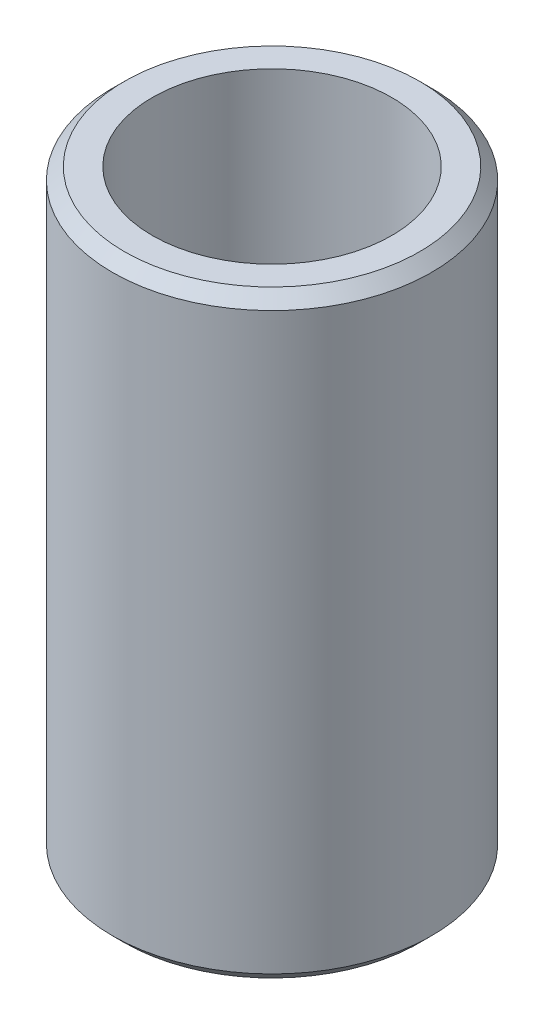
ISO-10303-21;
HEADER;
FILE_DESCRIPTION(('STEP AP214'),'2;1');
FILE_NAME('part.step','',(''),(''),'','','');
FILE_SCHEMA(('AUTOMOTIVE_DESIGN { 1 0 10303 214 1 1 1 1 }'));
ENDSEC;
DATA;
#1=APPLICATION_CONTEXT('core data for automotive mechanical design processes');
#2=APPLICATION_PROTOCOL_DEFINITION('international standard','automotive_design',2000,#1);
#3=PRODUCT_CONTEXT('',#1,'mechanical');
#4=PRODUCT('Part','Part','',(#3));
#5=PRODUCT_RELATED_PRODUCT_CATEGORY('part','',(#4));
#6=PRODUCT_DEFINITION_FORMATION('','',#4);
#7=PRODUCT_DEFINITION_CONTEXT('part definition',#1,'design');
#8=PRODUCT_DEFINITION('design','',#6,#7);
#9=PRODUCT_DEFINITION_SHAPE('','',#8);
#10=(LENGTH_UNIT() NAMED_UNIT(*) SI_UNIT(.MILLI.,.METRE.));
#11=(NAMED_UNIT(*) PLANE_ANGLE_UNIT() SI_UNIT($,.RADIAN.));
#12=(NAMED_UNIT(*) SI_UNIT($,.STERADIAN.) SOLID_ANGLE_UNIT());
#13=UNCERTAINTY_MEASURE_WITH_UNIT(LENGTH_MEASURE(1.E-05),#10,'distance_accuracy_value','');
#14=(GEOMETRIC_REPRESENTATION_CONTEXT(3) GLOBAL_UNCERTAINTY_ASSIGNED_CONTEXT((#13)) GLOBAL_UNIT_ASSIGNED_CONTEXT((#10,
#11,#12)) REPRESENTATION_CONTEXT('',''));
#15=CARTESIAN_POINT('',(0.,0.,0.));
#16=DIRECTION('',(0.,0.,1.));
#17=DIRECTION('',(1.,0.,0.));
#18=AXIS2_PLACEMENT_3D('',#15,#16,#17);
#19=CARTESIAN_POINT('',(0.,15.,0.));
#20=DIRECTION('',(0.,1.,0.));
#21=DIRECTION('',(0.,0.,1.));
#22=AXIS2_PLACEMENT_3D('',#19,#20,#21);
#23=PLANE('',#22);
#24=CARTESIAN_POINT('',(0.,15.,0.));
#25=DIRECTION('',(0.,1.,0.));
#26=DIRECTION('',(0.,0.,1.));
#27=AXIS2_PLACEMENT_3D('',#24,#25,#26);
#28=CIRCLE('',#27,3.70000000000001);
#29=CARTESIAN_POINT('',(0.,15.,3.70000000000001));
#30=VERTEX_POINT('',#29);
#31=EDGE_CURVE('E10',#30,#30,#28,.T.);
#32=ORIENTED_EDGE('',*,*,#31,.T.);
#33=EDGE_LOOP('',(#32));
#34=FACE_BOUND('',#33,.T.);
#35=CARTESIAN_POINT('',(0.,15.,0.));
#36=DIRECTION('',(0.,1.,0.));
#37=DIRECTION('',(0.,0.,1.));
#38=AXIS2_PLACEMENT_3D('',#35,#36,#37);
#39=CIRCLE('',#38,3.);
#40=CARTESIAN_POINT('',(0.,15.,3.));
#41=VERTEX_POINT('',#40);
#42=EDGE_CURVE('E54',#41,#41,#39,.T.);
#43=ORIENTED_EDGE('',*,*,#42,.F.);
#44=EDGE_LOOP('',(#43));
#45=FACE_BOUND('',#44,.T.);
#46=ADVANCED_FACE('F33',(#34,#45),#23,.T.);
#47=CARTESIAN_POINT('',(0.,0.,0.));
#48=DIRECTION('',(0.,1.,0.));
#49=DIRECTION('',(0.,0.,1.));
#50=AXIS2_PLACEMENT_3D('',#47,#48,#49);
#51=PLANE('',#50);
#52=CARTESIAN_POINT('',(0.,0.,0.));
#53=DIRECTION('',(0.,1.,0.));
#54=DIRECTION('',(0.,0.,1.));
#55=AXIS2_PLACEMENT_3D('',#52,#53,#54);
#56=CIRCLE('',#55,3.69999999999999);
#57=CARTESIAN_POINT('',(0.,0.,3.69999999999999));
#58=VERTEX_POINT('',#57);
#59=EDGE_CURVE('E41',#58,#58,#56,.F.);
#60=ORIENTED_EDGE('',*,*,#59,.T.);
#61=EDGE_LOOP('',(#60));
#62=FACE_BOUND('',#61,.T.);
#63=CARTESIAN_POINT('',(0.,0.,0.));
#64=DIRECTION('',(0.,1.,0.));
#65=DIRECTION('',(0.,0.,1.));
#66=AXIS2_PLACEMENT_3D('',#63,#64,#65);
#67=CIRCLE('',#66,3.);
#68=CARTESIAN_POINT('',(0.,0.,3.));
#69=VERTEX_POINT('',#68);
#70=EDGE_CURVE('E55',#69,#69,#67,.T.);
#71=ORIENTED_EDGE('',*,*,#70,.T.);
#72=EDGE_LOOP('',(#71));
#73=FACE_BOUND('',#72,.T.);
#74=ADVANCED_FACE('F65',(#62,#73),#51,.F.);
#75=CARTESIAN_POINT('',(0.,15.,0.));
#76=DIRECTION('',(0.,-1.,0.));
#77=DIRECTION('',(0.,0.,-1.));
#78=AXIS2_PLACEMENT_3D('',#75,#76,#77);
#79=CYLINDRICAL_SURFACE('',#78,4.);
#80=CARTESIAN_POINT('',(0.,0.300000000000005,0.));
#81=DIRECTION('',(0.,1.,0.));
#82=DIRECTION('',(0.,0.,1.));
#83=AXIS2_PLACEMENT_3D('',#80,#81,#82);
#84=CIRCLE('',#83,4.);
#85=CARTESIAN_POINT('',(0.,0.300000000000005,4.));
#86=VERTEX_POINT('',#85);
#87=EDGE_CURVE('E45',#86,#86,#84,.T.);
#88=ORIENTED_EDGE('',*,*,#87,.T.);
#89=EDGE_LOOP('',(#88));
#90=FACE_BOUND('',#89,.T.);
#91=CARTESIAN_POINT('',(0.,14.7,0.));
#92=DIRECTION('',(0.,1.,0.));
#93=DIRECTION('',(0.,0.,1.));
#94=AXIS2_PLACEMENT_3D('',#91,#92,#93);
#95=CIRCLE('',#94,4.);
#96=CARTESIAN_POINT('',(0.,14.7,4.));
#97=VERTEX_POINT('',#96);
#98=EDGE_CURVE('E49',#97,#97,#95,.F.);
#99=ORIENTED_EDGE('',*,*,#98,.T.);
#100=EDGE_LOOP('',(#99));
#101=FACE_BOUND('',#100,.T.);
#102=ADVANCED_FACE('F70',(#90,#101),#79,.T.);
#103=CARTESIAN_POINT('',(0.,15.,0.));
#104=DIRECTION('',(0.,-1.,0.));
#105=DIRECTION('',(0.,0.,-1.));
#106=AXIS2_PLACEMENT_3D('',#103,#104,#105);
#107=CYLINDRICAL_SURFACE('',#106,3.);
#108=ORIENTED_EDGE('',*,*,#42,.T.);
#109=EDGE_LOOP('',(#108));
#110=FACE_BOUND('',#109,.T.);
#111=ORIENTED_EDGE('',*,*,#70,.F.);
#112=EDGE_LOOP('',(#111));
#113=FACE_BOUND('',#112,.T.);
#114=ADVANCED_FACE('F61',(#110,#113),#107,.F.);
#115=CARTESIAN_POINT('',(0.,0.300000000000005,0.));
#116=DIRECTION('',(0.,1.,0.));
#117=DIRECTION('',(0.,0.,1.));
#118=AXIS2_PLACEMENT_3D('',#115,#116,#117);
#119=CONICAL_SURFACE('',#118,4.,0.785398163397447);
#120=CARTESIAN_POINT('',(0.,0.,3.69999999999999));
#121=CARTESIAN_POINT('',(0.,0.00312500000000007,3.70312499999999));
#122=CARTESIAN_POINT('',(0.,0.0062500000000001,3.70624999999999));
#123=CARTESIAN_POINT('',(0.,0.0125000000000002,3.7125));
#124=CARTESIAN_POINT('',(0.,0.0156250000000002,3.71562499999999));
#125=CARTESIAN_POINT('',(0.,0.0218750000000003,3.72187499999999));
#126=CARTESIAN_POINT('',(0.,0.0250000000000004,3.725));
#127=CARTESIAN_POINT('',(0.,0.0312500000000005,3.73125));
#128=CARTESIAN_POINT('',(0.,0.0343750000000005,3.734375));
#129=CARTESIAN_POINT('',(0.,0.0406250000000006,3.740625));
#130=CARTESIAN_POINT('',(0.,0.0437500000000007,3.74375));
#131=CARTESIAN_POINT('',(0.,0.0500000000000008,3.75));
#132=CARTESIAN_POINT('',(0.,0.0531250000000009,3.753125));
#133=CARTESIAN_POINT('',(0.,0.0593750000000009,3.759375));
#134=CARTESIAN_POINT('',(0.,0.0625000000000009,3.7625));
#135=CARTESIAN_POINT('',(0.,0.0687500000000011,3.76875));
#136=CARTESIAN_POINT('',(0.,0.0718750000000012,3.771875));
#137=CARTESIAN_POINT('',(0.,0.0781250000000013,3.778125));
#138=CARTESIAN_POINT('',(0.,0.0812500000000013,3.78125));
#139=CARTESIAN_POINT('',(0.,0.0875000000000014,3.7875));
#140=CARTESIAN_POINT('',(0.,0.0906250000000014,3.790625));
#141=CARTESIAN_POINT('',(0.,0.0968750000000016,3.796875));
#142=CARTESIAN_POINT('',(0.,0.100000000000002,3.8));
#143=CARTESIAN_POINT('',(0.,0.106250000000002,3.80625));
#144=CARTESIAN_POINT('',(0.,0.109375000000002,3.809375));
#145=CARTESIAN_POINT('',(0.,0.115625000000002,3.815625));
#146=CARTESIAN_POINT('',(0.,0.118750000000002,3.81875));
#147=CARTESIAN_POINT('',(0.,0.125000000000002,3.825));
#148=CARTESIAN_POINT('',(0.,0.128125000000002,3.828125));
#149=CARTESIAN_POINT('',(0.,0.134375000000002,3.834375));
#150=CARTESIAN_POINT('',(0.,0.137500000000002,3.8375));
#151=CARTESIAN_POINT('',(0.,0.143750000000002,3.84375));
#152=CARTESIAN_POINT('',(0.,0.146875000000002,3.846875));
#153=CARTESIAN_POINT('',(0.,0.153125000000003,3.853125));
#154=CARTESIAN_POINT('',(0.,0.156250000000003,3.85625));
#155=CARTESIAN_POINT('',(0.,0.162500000000003,3.8625));
#156=CARTESIAN_POINT('',(0.,0.165625000000003,3.865625));
#157=CARTESIAN_POINT('',(0.,0.171875000000003,3.871875));
#158=CARTESIAN_POINT('',(0.,0.175000000000003,3.875));
#159=CARTESIAN_POINT('',(0.,0.181250000000003,3.88125));
#160=CARTESIAN_POINT('',(0.,0.184375000000003,3.884375));
#161=CARTESIAN_POINT('',(0.,0.190625000000003,3.890625));
#162=CARTESIAN_POINT('',(0.,0.193750000000003,3.89375));
#163=CARTESIAN_POINT('',(0.,0.200000000000003,3.9));
#164=CARTESIAN_POINT('',(0.,0.203125000000003,3.903125));
#165=CARTESIAN_POINT('',(0.,0.209375000000004,3.909375));
#166=CARTESIAN_POINT('',(0.,0.212500000000004,3.9125));
#167=CARTESIAN_POINT('',(0.,0.218750000000004,3.91875));
#168=CARTESIAN_POINT('',(0.,0.221875000000004,3.921875));
#169=CARTESIAN_POINT('',(0.,0.228125000000004,3.928125));
#170=CARTESIAN_POINT('',(0.,0.231250000000004,3.93125));
#171=CARTESIAN_POINT('',(0.,0.237500000000004,3.9375));
#172=CARTESIAN_POINT('',(0.,0.240625000000004,3.940625));
#173=CARTESIAN_POINT('',(0.,0.246875000000004,3.946875));
#174=CARTESIAN_POINT('',(0.,0.250000000000004,3.95));
#175=CARTESIAN_POINT('',(0.,0.256250000000004,3.95625));
#176=CARTESIAN_POINT('',(0.,0.259375000000004,3.959375));
#177=CARTESIAN_POINT('',(0.,0.265625000000004,3.965625));
#178=CARTESIAN_POINT('',(0.,0.268750000000004,3.96875));
#179=CARTESIAN_POINT('',(0.,0.275000000000005,3.975));
#180=CARTESIAN_POINT('',(0.,0.278125000000005,3.978125));
#181=CARTESIAN_POINT('',(0.,0.284375000000005,3.984375));
#182=CARTESIAN_POINT('',(0.,0.287500000000005,3.9875));
#183=CARTESIAN_POINT('',(0.,0.293750000000005,3.99375));
#184=CARTESIAN_POINT('',(0.,0.296875000000005,3.996875));
#185=CARTESIAN_POINT('',(0.,0.300000000000005,4.));
#186=B_SPLINE_CURVE_WITH_KNOTS('',3,(#120,#121,#122,#123,#124,#125,#126,#127,#128,#129,#130,
#131,#132,#133,#134,#135,#136,#137,#138,#139,#140,#141,#142,#143,#144,#145,#146,#147,#148,#149,
#150,#151,#152,#153,#154,#155,#156,#157,#158,#159,#160,#161,#162,#163,#164,#165,#166,#167,#168,
#169,#170,#171,#172,#173,#174,#175,#176,#177,#178,#179,#180,#181,#182,#183,#184,#185),
.UNSPECIFIED.,.F.,.F.,(4,2,2,2,2,2,2,2,2,2,2,2,2,2,2,2,2,2,2,2,2,2,2,2,2,2,2,2,2,2,2,2,4),(0.,
0.0132582521472478,0.0265165042944958,0.0397747564417439,0.053033008588992,0.0662912607362397,
0.0795495128834878,0.0928077650307359,0.106066017177984,0.119324269325232,0.13258252147248,
0.145840773619728,0.159099025766976,0.172357277914224,0.185615530061472,0.19887378220872,
0.212132034355968,0.225390286503216,0.238648538650463,0.251906790797711,0.26516504294496,
0.278423295092207,0.291681547239455,0.304939799386703,0.318198051533951,0.3314563036812,
0.344714555828447,0.357972807975695,0.371231060122944,0.384489312270191,0.397747564417439,
0.411005816564687,0.424264068711935),.UNSPECIFIED.);
#187=EDGE_CURVE('BSEAM77',#58,#86,#186,.T.);
#188=ORIENTED_EDGE('',*,*,#59,.F.);
#189=ORIENTED_EDGE('',*,*,#87,.F.);
#190=ORIENTED_EDGE('',*,*,#187,.T.);
#191=ORIENTED_EDGE('',*,*,#187,.F.);
#192=EDGE_LOOP('',(#188,#190,#189,#191));
#193=FACE_BOUND('',#192,.T.);
#194=ADVANCED_FACE('F77',(#193),#119,.T.);
#195=CARTESIAN_POINT('',(0.,15.,0.));
#196=DIRECTION('',(0.,-1.,0.));
#197=DIRECTION('',(0.,0.,-1.));
#198=AXIS2_PLACEMENT_3D('',#195,#196,#197);
#199=CONICAL_SURFACE('',#198,3.70000000000001,0.785398163397447);
#200=ORIENTED_EDGE('',*,*,#98,.F.);
#201=EDGE_LOOP('',(#200));
#202=FACE_BOUND('',#201,.T.);
#203=ORIENTED_EDGE('',*,*,#31,.F.);
#204=EDGE_LOOP('',(#203));
#205=FACE_BOUND('',#204,.T.);
#206=ADVANCED_FACE('F36',(#202,#205),#199,.T.);
#207=CLOSED_SHELL('',(#46,#74,#102,#114,#194,#206));
#208=MANIFOLD_SOLID_BREP('B2',#207);
#209=ADVANCED_BREP_SHAPE_REPRESENTATION('',(#18,#208),#14);
#210=SHAPE_DEFINITION_REPRESENTATION(#9,#209);
ENDSEC;
END-ISO-10303-21;
